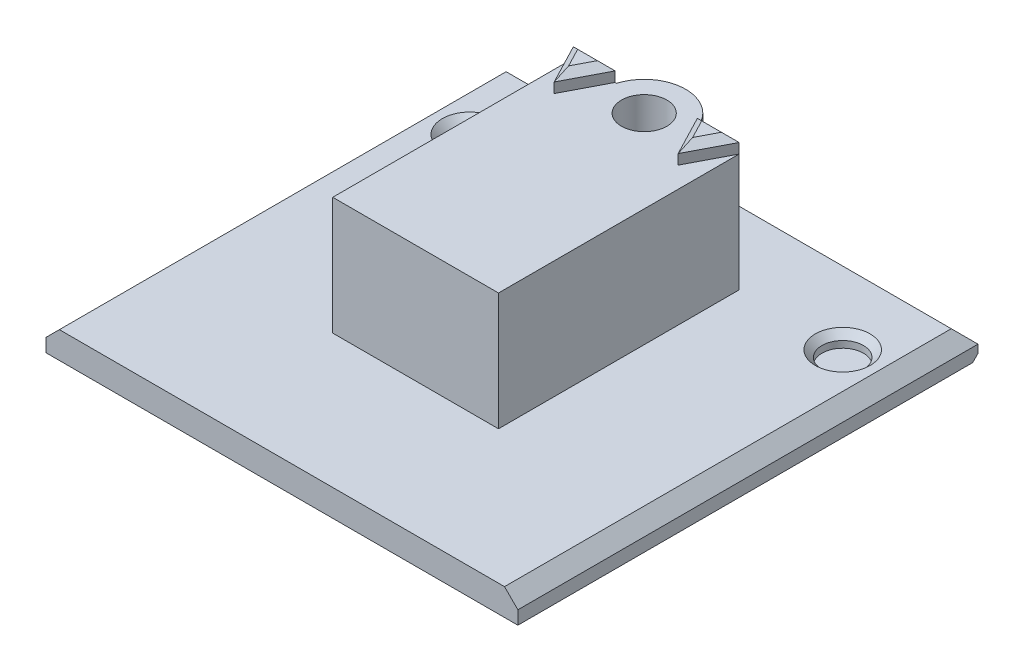
ISO-10303-21;
HEADER;
FILE_DESCRIPTION(('STEP AP214'),'2;1');
FILE_NAME('part.step','',(''),(''),'','','');
FILE_SCHEMA(('AUTOMOTIVE_DESIGN { 1 0 10303 214 1 1 1 1 }'));
ENDSEC;
DATA;
#1=APPLICATION_CONTEXT('core data for automotive mechanical design processes');
#2=APPLICATION_PROTOCOL_DEFINITION('international standard','automotive_design',2000,#1);
#3=PRODUCT_CONTEXT('',#1,'mechanical');
#4=PRODUCT('Part','Part','',(#3));
#5=PRODUCT_RELATED_PRODUCT_CATEGORY('part','',(#4));
#6=PRODUCT_DEFINITION_FORMATION('','',#4);
#7=PRODUCT_DEFINITION_CONTEXT('part definition',#1,'design');
#8=PRODUCT_DEFINITION('design','',#6,#7);
#9=PRODUCT_DEFINITION_SHAPE('','',#8);
#10=(LENGTH_UNIT() NAMED_UNIT(*) SI_UNIT(.MILLI.,.METRE.));
#11=(NAMED_UNIT(*) PLANE_ANGLE_UNIT() SI_UNIT($,.RADIAN.));
#12=(NAMED_UNIT(*) SI_UNIT($,.STERADIAN.) SOLID_ANGLE_UNIT());
#13=UNCERTAINTY_MEASURE_WITH_UNIT(LENGTH_MEASURE(1.E-05),#10,'distance_accuracy_value','');
#14=(GEOMETRIC_REPRESENTATION_CONTEXT(3) GLOBAL_UNCERTAINTY_ASSIGNED_CONTEXT((#13)) GLOBAL_UNIT_ASSIGNED_CONTEXT((#10,
#11,#12)) REPRESENTATION_CONTEXT('',''));
#15=CARTESIAN_POINT('',(0.,0.,0.));
#16=DIRECTION('',(0.,0.,1.));
#17=DIRECTION('',(1.,0.,0.));
#18=AXIS2_PLACEMENT_3D('',#15,#16,#17);
#19=CARTESIAN_POINT('',(17.65,0.,-27.1));
#20=DIRECTION('',(0.,1.,0.));
#21=DIRECTION('',(0.,0.,1.));
#22=AXIS2_PLACEMENT_3D('',#19,#20,#21);
#23=CYLINDRICAL_SURFACE('',#22,1.7);
#24=CARTESIAN_POINT('',(17.65,10.8,-27.1));
#25=DIRECTION('',(0.,1.,0.));
#26=DIRECTION('',(0.,0.,1.));
#27=AXIS2_PLACEMENT_3D('',#24,#25,#26);
#28=CIRCLE('',#27,1.7);
#29=CARTESIAN_POINT('',(17.65,10.8,-25.4));
#30=VERTEX_POINT('',#29);
#31=EDGE_CURVE('E217',#30,#30,#28,.T.);
#32=CARTESIAN_POINT('',(17.65,3.,-27.1));
#33=DIRECTION('',(0.,-1.,0.));
#34=DIRECTION('',(0.,0.,-1.));
#35=AXIS2_PLACEMENT_3D('',#32,#33,#34);
#36=CIRCLE('',#35,1.7);
#37=CARTESIAN_POINT('',(17.65,3.,-25.4));
#38=VERTEX_POINT('',#37);
#39=EDGE_CURVE('E317',#38,#38,#36,.F.);
#40=CARTESIAN_POINT('',(17.65,10.8,-25.4));
#41=CARTESIAN_POINT('',(17.65,10.71875,-25.4));
#42=CARTESIAN_POINT('',(17.65,10.6375,-25.4));
#43=CARTESIAN_POINT('',(17.65,10.475,-25.4));
#44=CARTESIAN_POINT('',(17.65,10.39375,-25.4));
#45=CARTESIAN_POINT('',(17.65,10.23125,-25.4));
#46=CARTESIAN_POINT('',(17.65,10.15,-25.4));
#47=CARTESIAN_POINT('',(17.65,9.9875,-25.4));
#48=CARTESIAN_POINT('',(17.65,9.90625,-25.4));
#49=CARTESIAN_POINT('',(17.65,9.74375,-25.4));
#50=CARTESIAN_POINT('',(17.65,9.6625,-25.4));
#51=CARTESIAN_POINT('',(17.65,9.5,-25.4));
#52=CARTESIAN_POINT('',(17.65,9.41875,-25.4));
#53=CARTESIAN_POINT('',(17.65,9.25625,-25.4));
#54=CARTESIAN_POINT('',(17.65,9.175,-25.4));
#55=CARTESIAN_POINT('',(17.65,9.0125,-25.4));
#56=CARTESIAN_POINT('',(17.65,8.93125,-25.4));
#57=CARTESIAN_POINT('',(17.65,8.76875,-25.4));
#58=CARTESIAN_POINT('',(17.65,8.6875,-25.4));
#59=CARTESIAN_POINT('',(17.65,8.525,-25.4));
#60=CARTESIAN_POINT('',(17.65,8.44375,-25.4));
#61=CARTESIAN_POINT('',(17.65,8.28125,-25.4));
#62=CARTESIAN_POINT('',(17.65,8.2,-25.4));
#63=CARTESIAN_POINT('',(17.65,8.0375,-25.4));
#64=CARTESIAN_POINT('',(17.65,7.95625,-25.4));
#65=CARTESIAN_POINT('',(17.65,7.79375,-25.4));
#66=CARTESIAN_POINT('',(17.65,7.7125,-25.4));
#67=CARTESIAN_POINT('',(17.65,7.55,-25.4));
#68=CARTESIAN_POINT('',(17.65,7.46875,-25.4));
#69=CARTESIAN_POINT('',(17.65,7.30625,-25.4));
#70=CARTESIAN_POINT('',(17.65,7.225,-25.4));
#71=CARTESIAN_POINT('',(17.65,7.0625,-25.4));
#72=CARTESIAN_POINT('',(17.65,6.98125,-25.4));
#73=CARTESIAN_POINT('',(17.65,6.81875,-25.4));
#74=CARTESIAN_POINT('',(17.65,6.7375,-25.4));
#75=CARTESIAN_POINT('',(17.65,6.575,-25.4));
#76=CARTESIAN_POINT('',(17.65,6.49375,-25.4));
#77=CARTESIAN_POINT('',(17.65,6.33125,-25.4));
#78=CARTESIAN_POINT('',(17.65,6.25,-25.4));
#79=CARTESIAN_POINT('',(17.65,6.0875,-25.4));
#80=CARTESIAN_POINT('',(17.65,6.00625,-25.4));
#81=CARTESIAN_POINT('',(17.65,5.84375,-25.4));
#82=CARTESIAN_POINT('',(17.65,5.7625,-25.4));
#83=CARTESIAN_POINT('',(17.65,5.6,-25.4));
#84=CARTESIAN_POINT('',(17.65,5.51875,-25.4));
#85=CARTESIAN_POINT('',(17.65,5.35625,-25.4));
#86=CARTESIAN_POINT('',(17.65,5.275,-25.4));
#87=CARTESIAN_POINT('',(17.65,5.1125,-25.4));
#88=CARTESIAN_POINT('',(17.65,5.03125,-25.4));
#89=CARTESIAN_POINT('',(17.65,4.86875,-25.4));
#90=CARTESIAN_POINT('',(17.65,4.7875,-25.4));
#91=CARTESIAN_POINT('',(17.65,4.625,-25.4));
#92=CARTESIAN_POINT('',(17.65,4.54375,-25.4));
#93=CARTESIAN_POINT('',(17.65,4.38125,-25.4));
#94=CARTESIAN_POINT('',(17.65,4.3,-25.4));
#95=CARTESIAN_POINT('',(17.65,4.1375,-25.4));
#96=CARTESIAN_POINT('',(17.65,4.05625,-25.4));
#97=CARTESIAN_POINT('',(17.65,3.89375,-25.4));
#98=CARTESIAN_POINT('',(17.65,3.8125,-25.4));
#99=CARTESIAN_POINT('',(17.65,3.65,-25.4));
#100=CARTESIAN_POINT('',(17.65,3.56875,-25.4));
#101=CARTESIAN_POINT('',(17.65,3.40625,-25.4));
#102=CARTESIAN_POINT('',(17.65,3.325,-25.4));
#103=CARTESIAN_POINT('',(17.65,3.1625,-25.4));
#104=CARTESIAN_POINT('',(17.65,3.08125,-25.4));
#105=CARTESIAN_POINT('',(17.65,3.,-25.4));
#106=B_SPLINE_CURVE_WITH_KNOTS('',3,(#40,#41,#42,#43,#44,#45,#46,#47,#48,#49,#50,#51,#52,#53,
#54,#55,#56,#57,#58,#59,#60,#61,#62,#63,#64,#65,#66,#67,#68,#69,#70,#71,#72,#73,#74,#75,#76,#77,
#78,#79,#80,#81,#82,#83,#84,#85,#86,#87,#88,#89,#90,#91,#92,#93,#94,#95,#96,#97,#98,#99,#100,
#101,#102,#103,#104,#105),.UNSPECIFIED.,.F.,.F.,(4,2,2,2,2,2,2,2,2,2,2,2,2,2,2,2,2,2,2,2,2,2,2,
2,2,2,2,2,2,2,2,2,4),(0.,0.243749999999999,0.4875,0.731249999999999,0.975,1.21875,1.4625,
1.70625,1.95,2.19375,2.4375,2.68125,2.925,3.16875,3.4125,3.65625,3.9,4.14375,4.3875,4.63125,
4.875,5.11875,5.3625,5.60625,5.85,6.09375,6.3375,6.58125,6.825,7.06875,7.3125,7.55625,7.8),.UNSPECIFIED.);
#107=EDGE_CURVE('BSEAM41',#30,#38,#106,.T.);
#108=ORIENTED_EDGE('',*,*,#31,.T.);
#109=ORIENTED_EDGE('',*,*,#39,.F.);
#110=ORIENTED_EDGE('',*,*,#107,.T.);
#111=ORIENTED_EDGE('',*,*,#107,.F.);
#112=EDGE_LOOP('',(#108,#110,#109,#111));
#113=FACE_BOUND('',#112,.T.);
#114=ADVANCED_FACE('F41',(#113),#23,.F.);
#115=CARTESIAN_POINT('',(0.,2.,0.));
#116=DIRECTION('',(0.,-1.,0.));
#117=DIRECTION('',(0.,0.,-1.));
#118=AXIS2_PLACEMENT_3D('',#115,#116,#117);
#119=PLANE('',#118);
#120=CARTESIAN_POINT('',(31.6,2.,-28.));
#121=DIRECTION('',(0.,-1.,0.));
#122=DIRECTION('',(0.,0.,-1.));
#123=AXIS2_PLACEMENT_3D('',#120,#121,#122);
#124=CIRCLE('',#123,2.05);
#125=CARTESIAN_POINT('',(31.6,2.,-30.05));
#126=VERTEX_POINT('',#125);
#127=EDGE_CURVE('E307',#126,#126,#124,.T.);
#128=ORIENTED_EDGE('',*,*,#127,.T.);
#129=EDGE_LOOP('',(#128));
#130=FACE_BOUND('',#129,.T.);
#131=CARTESIAN_POINT('',(3.69999999999999,2.,-28.));
#132=DIRECTION('',(0.,-1.,0.));
#133=DIRECTION('',(0.,0.,-1.));
#134=AXIS2_PLACEMENT_3D('',#131,#132,#133);
#135=CIRCLE('',#134,2.05);
#136=CARTESIAN_POINT('',(3.69999999999999,2.,-30.05));
#137=VERTEX_POINT('',#136);
#138=EDGE_CURVE('E306',#137,#137,#135,.T.);
#139=ORIENTED_EDGE('',*,*,#138,.T.);
#140=EDGE_LOOP('',(#139));
#141=FACE_BOUND('',#140,.T.);
#142=DIRECTION('',(1.,0.,0.));
#143=VECTOR('',#142,1.);
#144=CARTESIAN_POINT('',(0.,2.,0.));
#145=LINE('',#144,#143);
#146=CARTESIAN_POINT('',(1.,2.,0.));
#147=VERTEX_POINT('',#146);
#148=CARTESIAN_POINT('',(34.3,2.,0.));
#149=VERTEX_POINT('',#148);
#150=EDGE_CURVE('E281',#147,#149,#145,.T.);
#151=ORIENTED_EDGE('',*,*,#150,.T.);
#152=DIRECTION('',(0.,0.,-1.));
#153=VECTOR('',#152,1.);
#154=CARTESIAN_POINT('',(34.3,2.,0.));
#155=LINE('',#154,#153);
#156=CARTESIAN_POINT('',(34.3,2.,-33.42));
#157=VERTEX_POINT('',#156);
#158=EDGE_CURVE('E362',#149,#157,#155,.T.);
#159=ORIENTED_EDGE('',*,*,#158,.T.);
#160=DIRECTION('',(-1.,0.,0.));
#161=VECTOR('',#160,1.);
#162=CARTESIAN_POINT('',(0.,2.,-33.42));
#163=LINE('',#162,#161);
#164=CARTESIAN_POINT('',(1.,2.,-33.42));
#165=VERTEX_POINT('',#164);
#166=EDGE_CURVE('E361',#157,#165,#163,.T.);
#167=ORIENTED_EDGE('',*,*,#166,.T.);
#168=DIRECTION('',(0.,0.,1.));
#169=VECTOR('',#168,1.);
#170=CARTESIAN_POINT('',(1.,2.,0.));
#171=LINE('',#170,#169);
#172=EDGE_CURVE('E344',#165,#147,#171,.T.);
#173=ORIENTED_EDGE('',*,*,#172,.T.);
#174=EDGE_LOOP('',(#151,#159,#167,#173));
#175=FACE_BOUND('',#174,.T.);
#176=DIRECTION('',(0.,0.,-1.));
#177=VECTOR('',#176,1.);
#178=CARTESIAN_POINT('',(23.85,2.,-28.));
#179=LINE('',#178,#177);
#180=CARTESIAN_POINT('',(23.85,2.,-10.));
#181=VERTEX_POINT('',#180);
#182=CARTESIAN_POINT('',(23.85,2.,-28.));
#183=VERTEX_POINT('',#182);
#184=EDGE_CURVE('E231',#181,#183,#179,.T.);
#185=ORIENTED_EDGE('',*,*,#184,.F.);
#186=DIRECTION('',(1.,0.,0.));
#187=VECTOR('',#186,1.);
#188=CARTESIAN_POINT('',(11.45,2.,-10.));
#189=LINE('',#188,#187);
#190=CARTESIAN_POINT('',(11.45,2.,-10.));
#191=VERTEX_POINT('',#190);
#192=EDGE_CURVE('E238',#191,#181,#189,.T.);
#193=ORIENTED_EDGE('',*,*,#192,.F.);
#194=DIRECTION('',(0.,0.,1.));
#195=VECTOR('',#194,1.);
#196=CARTESIAN_POINT('',(11.45,2.,-28.));
#197=LINE('',#196,#195);
#198=CARTESIAN_POINT('',(11.45,2.,-28.));
#199=VERTEX_POINT('',#198);
#200=EDGE_CURVE('E262',#199,#191,#197,.T.);
#201=ORIENTED_EDGE('',*,*,#200,.F.);
#202=DIRECTION('',(-1.,0.,0.));
#203=VECTOR('',#202,1.);
#204=CARTESIAN_POINT('',(11.45,2.,-28.));
#205=LINE('',#204,#203);
#206=CARTESIAN_POINT('',(14.6835206051617,2.,-28.));
#207=VERTEX_POINT('',#206);
#208=EDGE_CURVE('E256',#207,#199,#205,.T.);
#209=ORIENTED_EDGE('',*,*,#208,.F.);
#210=CARTESIAN_POINT('',(17.65,2.,-27.1));
#211=DIRECTION('',(0.,1.,0.));
#212=DIRECTION('',(0.,0.,1.));
#213=AXIS2_PLACEMENT_3D('',#210,#211,#212);
#214=CIRCLE('',#213,3.1);
#215=CARTESIAN_POINT('',(20.6164793948383,2.,-28.));
#216=VERTEX_POINT('',#215);
#217=EDGE_CURVE('E253',#216,#207,#214,.T.);
#218=ORIENTED_EDGE('',*,*,#217,.F.);
#219=DIRECTION('',(-1.,0.,0.));
#220=VECTOR('',#219,1.);
#221=CARTESIAN_POINT('',(20.6164793948383,2.,-28.));
#222=LINE('',#221,#220);
#223=EDGE_CURVE('E255',#183,#216,#222,.T.);
#224=ORIENTED_EDGE('',*,*,#223,.F.);
#225=EDGE_LOOP('',(#185,#193,#201,#209,#218,#224));
#226=FACE_BOUND('',#225,.T.);
#227=ADVANCED_FACE('F420',(#130,#141,#175,#226),#119,.F.);
#228=CARTESIAN_POINT('',(0.,2.,0.));
#229=DIRECTION('',(1.,0.,0.));
#230=DIRECTION('',(0.,0.,-1.));
#231=AXIS2_PLACEMENT_3D('',#228,#229,#230);
#232=PLANE('',#231);
#233=DIRECTION('',(0.,-1.,0.));
#234=VECTOR('',#233,1.);
#235=CARTESIAN_POINT('',(0.,2.,-34.42));
#236=LINE('',#235,#234);
#237=CARTESIAN_POINT('',(0.,0.999999999999992,-34.42));
#238=VERTEX_POINT('',#237);
#239=CARTESIAN_POINT('',(0.,0.399999999999998,-34.42));
#240=VERTEX_POINT('',#239);
#241=EDGE_CURVE('E290',#238,#240,#236,.T.);
#242=ORIENTED_EDGE('',*,*,#241,.T.);
#243=DIRECTION('',(0.,-0.707106781186548,0.707106781186548));
#244=VECTOR('',#243,1.);
#245=CARTESIAN_POINT('',(0.,0.399999999999998,-34.42));
#246=LINE('',#245,#244);
#247=CARTESIAN_POINT('',(0.,0.,-34.02));
#248=VERTEX_POINT('',#247);
#249=EDGE_CURVE('E62',#240,#248,#246,.T.);
#250=ORIENTED_EDGE('',*,*,#249,.T.);
#251=DIRECTION('',(0.,0.,1.));
#252=VECTOR('',#251,1.);
#253=CARTESIAN_POINT('',(0.,0.,0.));
#254=LINE('',#253,#252);
#255=CARTESIAN_POINT('',(0.,0.,0.));
#256=VERTEX_POINT('',#255);
#257=EDGE_CURVE('E284',#248,#256,#254,.T.);
#258=ORIENTED_EDGE('',*,*,#257,.T.);
#259=DIRECTION('',(0.,-1.,0.));
#260=VECTOR('',#259,1.);
#261=CARTESIAN_POINT('',(0.,2.,0.));
#262=LINE('',#261,#260);
#263=CARTESIAN_POINT('',(0.,0.999999999999992,0.));
#264=VERTEX_POINT('',#263);
#265=EDGE_CURVE('E297',#264,#256,#262,.T.);
#266=ORIENTED_EDGE('',*,*,#265,.F.);
#267=DIRECTION('',(0.,0.,-1.));
#268=VECTOR('',#267,1.);
#269=CARTESIAN_POINT('',(0.,0.999999999999992,0.));
#270=LINE('',#269,#268);
#271=EDGE_CURVE('E376',#264,#238,#270,.T.);
#272=ORIENTED_EDGE('',*,*,#271,.T.);
#273=EDGE_LOOP('',(#242,#250,#258,#266,#272));
#274=FACE_BOUND('',#273,.T.);
#275=ADVANCED_FACE('F394',(#274),#232,.F.);
#276=CARTESIAN_POINT('',(0.,2.,0.));
#277=DIRECTION('',(0.,0.,-1.));
#278=DIRECTION('',(-1.,0.,0.));
#279=AXIS2_PLACEMENT_3D('',#276,#277,#278);
#280=PLANE('',#279);
#281=DIRECTION('',(0.,-1.,0.));
#282=VECTOR('',#281,1.);
#283=CARTESIAN_POINT('',(35.3,2.,0.));
#284=LINE('',#283,#282);
#285=CARTESIAN_POINT('',(35.3,0.999999999999992,0.));
#286=VERTEX_POINT('',#285);
#287=CARTESIAN_POINT('',(35.3,0.,0.));
#288=VERTEX_POINT('',#287);
#289=EDGE_CURVE('E296',#286,#288,#284,.T.);
#290=ORIENTED_EDGE('',*,*,#289,.F.);
#291=DIRECTION('',(0.707106781186545,-0.70710678118655,0.));
#292=VECTOR('',#291,1.);
#293=CARTESIAN_POINT('',(34.3,2.,0.));
#294=LINE('',#293,#292);
#295=EDGE_CURVE('E375',#286,#149,#294,.F.);
#296=ORIENTED_EDGE('',*,*,#295,.T.);
#297=ORIENTED_EDGE('',*,*,#150,.F.);
#298=DIRECTION('',(0.707106781186545,0.70710678118655,0.));
#299=VECTOR('',#298,1.);
#300=CARTESIAN_POINT('',(1.,2.,0.));
#301=LINE('',#300,#299);
#302=EDGE_CURVE('E369',#147,#264,#301,.F.);
#303=ORIENTED_EDGE('',*,*,#302,.T.);
#304=ORIENTED_EDGE('',*,*,#265,.T.);
#305=DIRECTION('',(1.,0.,0.));
#306=VECTOR('',#305,1.);
#307=CARTESIAN_POINT('',(0.,0.,0.));
#308=LINE('',#307,#306);
#309=EDGE_CURVE('E289',#256,#288,#308,.T.);
#310=ORIENTED_EDGE('',*,*,#309,.T.);
#311=EDGE_LOOP('',(#290,#296,#297,#303,#304,#310));
#312=FACE_BOUND('',#311,.T.);
#313=ADVANCED_FACE('F413',(#312),#280,.F.);
#314=CARTESIAN_POINT('',(35.3,2.,0.));
#315=DIRECTION('',(-1.,0.,0.));
#316=DIRECTION('',(0.,0.,1.));
#317=AXIS2_PLACEMENT_3D('',#314,#315,#316);
#318=PLANE('',#317);
#319=DIRECTION('',(0.,0.,-1.));
#320=VECTOR('',#319,1.);
#321=CARTESIAN_POINT('',(35.3,0.,0.));
#322=LINE('',#321,#320);
#323=CARTESIAN_POINT('',(35.3,0.,-34.02));
#324=VERTEX_POINT('',#323);
#325=EDGE_CURVE('E286',#288,#324,#322,.T.);
#326=ORIENTED_EDGE('',*,*,#325,.T.);
#327=DIRECTION('',(0.,0.707106781186548,-0.707106781186548));
#328=VECTOR('',#327,1.);
#329=CARTESIAN_POINT('',(35.3,0.399999999999998,-34.42));
#330=LINE('',#329,#328);
#331=CARTESIAN_POINT('',(35.3,0.399999999999998,-34.42));
#332=VERTEX_POINT('',#331);
#333=EDGE_CURVE('E11',#324,#332,#330,.T.);
#334=ORIENTED_EDGE('',*,*,#333,.T.);
#335=DIRECTION('',(0.,-1.,0.));
#336=VECTOR('',#335,1.);
#337=CARTESIAN_POINT('',(35.3,2.,-34.42));
#338=LINE('',#337,#336);
#339=CARTESIAN_POINT('',(35.3,0.999999999999992,-34.42));
#340=VERTEX_POINT('',#339);
#341=EDGE_CURVE('E294',#340,#332,#338,.T.);
#342=ORIENTED_EDGE('',*,*,#341,.F.);
#343=DIRECTION('',(0.,0.,1.));
#344=VECTOR('',#343,1.);
#345=CARTESIAN_POINT('',(35.3,0.999999999999992,0.));
#346=LINE('',#345,#344);
#347=EDGE_CURVE('E368',#340,#286,#346,.T.);
#348=ORIENTED_EDGE('',*,*,#347,.T.);
#349=ORIENTED_EDGE('',*,*,#289,.T.);
#350=EDGE_LOOP('',(#326,#334,#342,#348,#349));
#351=FACE_BOUND('',#350,.T.);
#352=ADVANCED_FACE('F410',(#351),#318,.F.);
#353=CARTESIAN_POINT('',(0.,2.,-34.42));
#354=DIRECTION('',(0.,0.,1.));
#355=DIRECTION('',(1.,0.,0.));
#356=AXIS2_PLACEMENT_3D('',#353,#354,#355);
#357=PLANE('',#356);
#358=ORIENTED_EDGE('',*,*,#341,.T.);
#359=DIRECTION('',(-1.,0.,0.));
#360=VECTOR('',#359,1.);
#361=CARTESIAN_POINT('',(0.,0.399999999999998,-34.42));
#362=LINE('',#361,#360);
#363=EDGE_CURVE('E377',#332,#240,#362,.T.);
#364=ORIENTED_EDGE('',*,*,#363,.T.);
#365=ORIENTED_EDGE('',*,*,#241,.F.);
#366=DIRECTION('',(1.,0.,0.));
#367=VECTOR('',#366,1.);
#368=CARTESIAN_POINT('',(0.,0.999999999999992,-34.42));
#369=LINE('',#368,#367);
#370=EDGE_CURVE('E372',#238,#340,#369,.T.);
#371=ORIENTED_EDGE('',*,*,#370,.T.);
#372=EDGE_LOOP('',(#358,#364,#365,#371));
#373=FACE_BOUND('',#372,.T.);
#374=ADVANCED_FACE('F386',(#373),#357,.F.);
#375=CARTESIAN_POINT('',(0.,0.,0.));
#376=DIRECTION('',(0.,-1.,0.));
#377=DIRECTION('',(0.,0.,-1.));
#378=AXIS2_PLACEMENT_3D('',#375,#376,#377);
#379=PLANE('',#378);
#380=CARTESIAN_POINT('',(17.65,0.,-27.1));
#381=DIRECTION('',(0.,-1.,0.));
#382=DIRECTION('',(0.,0.,-1.));
#383=AXIS2_PLACEMENT_3D('',#380,#381,#382);
#384=CIRCLE('',#383,2.85);
#385=CARTESIAN_POINT('',(17.65,0.,-29.95));
#386=VERTEX_POINT('',#385);
#387=EDGE_CURVE('E352',#386,#386,#384,.T.);
#388=ORIENTED_EDGE('',*,*,#387,.F.);
#389=EDGE_LOOP('',(#388));
#390=FACE_BOUND('',#389,.T.);
#391=ORIENTED_EDGE('',*,*,#257,.F.);
#392=DIRECTION('',(1.,0.,0.));
#393=VECTOR('',#392,1.);
#394=CARTESIAN_POINT('',(35.3,0.,-34.02));
#395=LINE('',#394,#393);
#396=EDGE_CURVE('E49',#248,#324,#395,.T.);
#397=ORIENTED_EDGE('',*,*,#396,.T.);
#398=ORIENTED_EDGE('',*,*,#325,.F.);
#399=ORIENTED_EDGE('',*,*,#309,.F.);
#400=EDGE_LOOP('',(#391,#397,#398,#399));
#401=FACE_BOUND('',#400,.T.);
#402=ADVANCED_FACE('F747',(#390,#401),#379,.T.);
#403=CARTESIAN_POINT('',(23.85,10.8,-28.));
#404=DIRECTION('',(-1.,0.,0.));
#405=DIRECTION('',(0.,0.,1.));
#406=AXIS2_PLACEMENT_3D('',#403,#404,#405);
#407=PLANE('',#406);
#408=ORIENTED_EDGE('',*,*,#184,.T.);
#409=DIRECTION('',(0.,-1.,0.));
#410=VECTOR('',#409,1.);
#411=CARTESIAN_POINT('',(23.85,10.8,-28.));
#412=LINE('',#411,#410);
#413=CARTESIAN_POINT('',(23.85,10.8,-28.));
#414=VERTEX_POINT('',#413);
#415=EDGE_CURVE('E279',#414,#183,#412,.T.);
#416=ORIENTED_EDGE('',*,*,#415,.F.);
#417=DIRECTION('',(0.,0.,-1.));
#418=VECTOR('',#417,1.);
#419=CARTESIAN_POINT('',(23.85,10.8,-28.));
#420=LINE('',#419,#418);
#421=CARTESIAN_POINT('',(23.85,10.8,-10.));
#422=VERTEX_POINT('',#421);
#423=EDGE_CURVE('E204',#422,#414,#420,.T.);
#424=ORIENTED_EDGE('',*,*,#423,.F.);
#425=DIRECTION('',(0.,-1.,0.));
#426=VECTOR('',#425,1.);
#427=CARTESIAN_POINT('',(23.85,10.8,-10.));
#428=LINE('',#427,#426);
#429=EDGE_CURVE('E248',#422,#181,#428,.T.);
#430=ORIENTED_EDGE('',*,*,#429,.T.);
#431=EDGE_LOOP('',(#408,#416,#424,#430));
#432=FACE_BOUND('',#431,.T.);
#433=ADVANCED_FACE('F426',(#432),#407,.F.);
#434=CARTESIAN_POINT('',(20.6164793948383,10.8,-28.));
#435=DIRECTION('',(0.,0.,1.));
#436=DIRECTION('',(1.,0.,0.));
#437=AXIS2_PLACEMENT_3D('',#434,#435,#436);
#438=PLANE('',#437);
#439=DIRECTION('',(0.,-1.,0.));
#440=VECTOR('',#439,1.);
#441=CARTESIAN_POINT('',(20.7265976966895,12.05,-28.));
#442=LINE('',#441,#440);
#443=CARTESIAN_POINT('',(20.7265976966895,11.55,-28.));
#444=VERTEX_POINT('',#443);
#445=CARTESIAN_POINT('',(20.7265976966895,10.8,-28.));
#446=VERTEX_POINT('',#445);
#447=EDGE_CURVE('E194',#444,#446,#442,.T.);
#448=ORIENTED_EDGE('',*,*,#447,.F.);
#449=DIRECTION('',(1.,0.,0.));
#450=VECTOR('',#449,1.);
#451=CARTESIAN_POINT('',(20.6164793948383,11.55,-28.));
#452=LINE('',#451,#450);
#453=CARTESIAN_POINT('',(23.85,11.55,-28.));
#454=VERTEX_POINT('',#453);
#455=EDGE_CURVE('E345',#444,#454,#452,.T.);
#456=ORIENTED_EDGE('',*,*,#455,.T.);
#457=DIRECTION('',(0.,-1.,0.));
#458=VECTOR('',#457,1.);
#459=CARTESIAN_POINT('',(23.85,12.05,-28.));
#460=LINE('',#459,#458);
#461=EDGE_CURVE('E197',#454,#414,#460,.T.);
#462=ORIENTED_EDGE('',*,*,#461,.T.);
#463=ORIENTED_EDGE('',*,*,#415,.T.);
#464=ORIENTED_EDGE('',*,*,#223,.T.);
#465=DIRECTION('',(0.,-1.,0.));
#466=VECTOR('',#465,1.);
#467=CARTESIAN_POINT('',(20.6164793948383,10.8,-28.));
#468=LINE('',#467,#466);
#469=CARTESIAN_POINT('',(20.6164793948383,10.8,-28.));
#470=VERTEX_POINT('',#469);
#471=EDGE_CURVE('E280',#470,#216,#468,.T.);
#472=ORIENTED_EDGE('',*,*,#471,.F.);
#473=DIRECTION('',(-1.,0.,0.));
#474=VECTOR('',#473,1.);
#475=CARTESIAN_POINT('',(20.6164793948383,10.8,-28.));
#476=LINE('',#475,#474);
#477=EDGE_CURVE('E240',#446,#470,#476,.T.);
#478=ORIENTED_EDGE('',*,*,#477,.F.);
#479=EDGE_LOOP('',(#448,#456,#462,#463,#464,#472,#478));
#480=FACE_BOUND('',#479,.T.);
#481=ADVANCED_FACE('F427',(#480),#438,.F.);
#482=CARTESIAN_POINT('',(17.65,10.8,-27.1));
#483=DIRECTION('',(0.,-1.,0.));
#484=DIRECTION('',(0.,0.,-1.));
#485=AXIS2_PLACEMENT_3D('',#482,#483,#484);
#486=CYLINDRICAL_SURFACE('',#485,3.1);
#487=ORIENTED_EDGE('',*,*,#217,.T.);
#488=DIRECTION('',(0.,-1.,0.));
#489=VECTOR('',#488,1.);
#490=CARTESIAN_POINT('',(14.6835206051617,10.8,-28.));
#491=LINE('',#490,#489);
#492=CARTESIAN_POINT('',(14.6835206051617,10.8,-28.));
#493=VERTEX_POINT('',#492);
#494=EDGE_CURVE('E274',#493,#207,#491,.T.);
#495=ORIENTED_EDGE('',*,*,#494,.F.);
#496=CARTESIAN_POINT('',(17.65,10.8,-27.1));
#497=DIRECTION('',(0.,1.,0.));
#498=DIRECTION('',(0.,0.,1.));
#499=AXIS2_PLACEMENT_3D('',#496,#497,#498);
#500=CIRCLE('',#499,3.1);
#501=EDGE_CURVE('E239',#470,#493,#500,.T.);
#502=ORIENTED_EDGE('',*,*,#501,.F.);
#503=ORIENTED_EDGE('',*,*,#471,.T.);
#504=EDGE_LOOP('',(#487,#495,#502,#503));
#505=FACE_BOUND('',#504,.T.);
#506=ADVANCED_FACE('F448',(#505),#486,.T.);
#507=CARTESIAN_POINT('',(11.45,10.8,-28.));
#508=DIRECTION('',(0.,0.,1.));
#509=DIRECTION('',(1.,0.,0.));
#510=AXIS2_PLACEMENT_3D('',#507,#508,#509);
#511=PLANE('',#510);
#512=DIRECTION('',(0.,-1.,0.));
#513=VECTOR('',#512,1.);
#514=CARTESIAN_POINT('',(11.45,12.05,-28.));
#515=LINE('',#514,#513);
#516=CARTESIAN_POINT('',(11.45,11.55,-28.));
#517=VERTEX_POINT('',#516);
#518=CARTESIAN_POINT('',(11.45,10.8,-28.));
#519=VERTEX_POINT('',#518);
#520=EDGE_CURVE('E225',#517,#519,#515,.T.);
#521=ORIENTED_EDGE('',*,*,#520,.F.);
#522=DIRECTION('',(1.,0.,0.));
#523=VECTOR('',#522,1.);
#524=CARTESIAN_POINT('',(14.5734023033105,11.55,-28.));
#525=LINE('',#524,#523);
#526=CARTESIAN_POINT('',(14.5734023033105,11.55,-28.));
#527=VERTEX_POINT('',#526);
#528=EDGE_CURVE('E326',#517,#527,#525,.T.);
#529=ORIENTED_EDGE('',*,*,#528,.T.);
#530=DIRECTION('',(0.,-1.,0.));
#531=VECTOR('',#530,1.);
#532=CARTESIAN_POINT('',(14.5734023033105,12.05,-28.));
#533=LINE('',#532,#531);
#534=CARTESIAN_POINT('',(14.5734023033105,10.8,-28.));
#535=VERTEX_POINT('',#534);
#536=EDGE_CURVE('E228',#527,#535,#533,.T.);
#537=ORIENTED_EDGE('',*,*,#536,.T.);
#538=DIRECTION('',(-1.,0.,0.));
#539=VECTOR('',#538,1.);
#540=CARTESIAN_POINT('',(11.45,10.8,-28.));
#541=LINE('',#540,#539);
#542=EDGE_CURVE('E245',#493,#535,#541,.T.);
#543=ORIENTED_EDGE('',*,*,#542,.F.);
#544=ORIENTED_EDGE('',*,*,#494,.T.);
#545=ORIENTED_EDGE('',*,*,#208,.T.);
#546=DIRECTION('',(0.,-1.,0.));
#547=VECTOR('',#546,1.);
#548=CARTESIAN_POINT('',(11.45,10.8,-28.));
#549=LINE('',#548,#547);
#550=EDGE_CURVE('E272',#519,#199,#549,.T.);
#551=ORIENTED_EDGE('',*,*,#550,.F.);
#552=EDGE_LOOP('',(#521,#529,#537,#543,#544,#545,#551));
#553=FACE_BOUND('',#552,.T.);
#554=ADVANCED_FACE('F451',(#553),#511,.F.);
#555=CARTESIAN_POINT('',(11.45,10.8,-28.));
#556=DIRECTION('',(1.,0.,0.));
#557=DIRECTION('',(0.,0.,-1.));
#558=AXIS2_PLACEMENT_3D('',#555,#556,#557);
#559=PLANE('',#558);
#560=ORIENTED_EDGE('',*,*,#200,.T.);
#561=DIRECTION('',(0.,-1.,0.));
#562=VECTOR('',#561,1.);
#563=CARTESIAN_POINT('',(11.45,10.8,-10.));
#564=LINE('',#563,#562);
#565=CARTESIAN_POINT('',(11.45,10.8,-10.));
#566=VERTEX_POINT('',#565);
#567=EDGE_CURVE('E266',#566,#191,#564,.T.);
#568=ORIENTED_EDGE('',*,*,#567,.F.);
#569=DIRECTION('',(0.,0.,1.));
#570=VECTOR('',#569,1.);
#571=CARTESIAN_POINT('',(11.45,10.8,-28.));
#572=LINE('',#571,#570);
#573=EDGE_CURVE('E244',#519,#566,#572,.T.);
#574=ORIENTED_EDGE('',*,*,#573,.F.);
#575=ORIENTED_EDGE('',*,*,#550,.T.);
#576=EDGE_LOOP('',(#560,#568,#574,#575));
#577=FACE_BOUND('',#576,.T.);
#578=ADVANCED_FACE('F476',(#577),#559,.F.);
#579=CARTESIAN_POINT('',(11.45,10.8,-10.));
#580=DIRECTION('',(0.,0.,-1.));
#581=DIRECTION('',(-1.,0.,0.));
#582=AXIS2_PLACEMENT_3D('',#579,#580,#581);
#583=PLANE('',#582);
#584=ORIENTED_EDGE('',*,*,#192,.T.);
#585=ORIENTED_EDGE('',*,*,#429,.F.);
#586=DIRECTION('',(1.,0.,0.));
#587=VECTOR('',#586,1.);
#588=CARTESIAN_POINT('',(11.45,10.8,-10.));
#589=LINE('',#588,#587);
#590=EDGE_CURVE('E250',#566,#422,#589,.T.);
#591=ORIENTED_EDGE('',*,*,#590,.F.);
#592=ORIENTED_EDGE('',*,*,#567,.T.);
#593=EDGE_LOOP('',(#584,#585,#591,#592));
#594=FACE_BOUND('',#593,.T.);
#595=ADVANCED_FACE('F424',(#594),#583,.F.);
#596=CARTESIAN_POINT('',(17.65,10.8,-27.1));
#597=DIRECTION('',(0.,1.,0.));
#598=DIRECTION('',(0.,0.,1.));
#599=AXIS2_PLACEMENT_3D('',#596,#597,#598);
#600=PLANE('',#599);
#601=ORIENTED_EDGE('',*,*,#31,.F.);
#602=EDGE_LOOP('',(#601));
#603=FACE_BOUND('',#602,.T.);
#604=DIRECTION('',(0.461748613235039,0.,-0.887010833178219));
#605=VECTOR('',#604,1.);
#606=CARTESIAN_POINT('',(23.85,10.8,-28.));
#607=LINE('',#606,#605);
#608=CARTESIAN_POINT('',(22.2882988483447,10.8,-25.));
#609=VERTEX_POINT('',#608);
#610=EDGE_CURVE('E189',#609,#414,#607,.T.);
#611=ORIENTED_EDGE('',*,*,#610,.F.);
#612=DIRECTION('',(0.461748613235039,0.,0.887010833178219));
#613=VECTOR('',#612,1.);
#614=CARTESIAN_POINT('',(20.7265976966895,10.8,-28.));
#615=LINE('',#614,#613);
#616=EDGE_CURVE('E205',#446,#609,#615,.T.);
#617=ORIENTED_EDGE('',*,*,#616,.F.);
#618=ORIENTED_EDGE('',*,*,#477,.T.);
#619=ORIENTED_EDGE('',*,*,#501,.T.);
#620=ORIENTED_EDGE('',*,*,#542,.T.);
#621=DIRECTION('',(0.461748613235039,0.,-0.887010833178219));
#622=VECTOR('',#621,1.);
#623=CARTESIAN_POINT('',(14.5734023033105,10.8,-28.));
#624=LINE('',#623,#622);
#625=CARTESIAN_POINT('',(13.0117011516553,10.8,-25.));
#626=VERTEX_POINT('',#625);
#627=EDGE_CURVE('E211',#626,#535,#624,.T.);
#628=ORIENTED_EDGE('',*,*,#627,.F.);
#629=DIRECTION('',(0.461748613235039,0.,0.887010833178219));
#630=VECTOR('',#629,1.);
#631=CARTESIAN_POINT('',(11.45,10.8,-28.));
#632=LINE('',#631,#630);
#633=EDGE_CURVE('E208',#519,#626,#632,.T.);
#634=ORIENTED_EDGE('',*,*,#633,.F.);
#635=ORIENTED_EDGE('',*,*,#573,.T.);
#636=ORIENTED_EDGE('',*,*,#590,.T.);
#637=ORIENTED_EDGE('',*,*,#423,.T.);
#638=EDGE_LOOP('',(#611,#617,#618,#619,#620,#628,#634,#635,#636,#637));
#639=FACE_BOUND('',#638,.T.);
#640=ADVANCED_FACE('F203',(#603,#639),#600,.T.);
#641=CARTESIAN_POINT('',(31.6,1.,-28.));
#642=DIRECTION('',(0.,1.,0.));
#643=DIRECTION('',(0.,0.,1.));
#644=AXIS2_PLACEMENT_3D('',#641,#642,#643);
#645=CYLINDRICAL_SURFACE('',#644,1.55);
#646=CARTESIAN_POINT('',(31.6,1.5,-28.));
#647=DIRECTION('',(0.,-1.,0.));
#648=DIRECTION('',(0.,0.,-1.));
#649=AXIS2_PLACEMENT_3D('',#646,#647,#648);
#650=CIRCLE('',#649,1.55);
#651=CARTESIAN_POINT('',(31.6,1.5,-29.55));
#652=VERTEX_POINT('',#651);
#653=EDGE_CURVE('E303',#652,#652,#650,.F.);
#654=ORIENTED_EDGE('',*,*,#653,.T.);
#655=EDGE_LOOP('',(#654));
#656=FACE_BOUND('',#655,.T.);
#657=CARTESIAN_POINT('',(31.6,1.,-28.));
#658=DIRECTION('',(0.,1.,0.));
#659=DIRECTION('',(0.,0.,-1.));
#660=AXIS2_PLACEMENT_3D('',#657,#658,#659);
#661=CIRCLE('',#660,1.55);
#662=CARTESIAN_POINT('',(31.6,1.,-29.55));
#663=VERTEX_POINT('',#662);
#664=EDGE_CURVE('E223',#663,#663,#661,.T.);
#665=ORIENTED_EDGE('',*,*,#664,.F.);
#666=EDGE_LOOP('',(#665));
#667=FACE_BOUND('',#666,.T.);
#668=ADVANCED_FACE('F529',(#656,#667),#645,.F.);
#669=CARTESIAN_POINT('',(31.6,1.,-28.));
#670=DIRECTION('',(0.,-1.,0.));
#671=DIRECTION('',(0.,0.,-1.));
#672=AXIS2_PLACEMENT_3D('',#669,#670,#671);
#673=PLANE('',#672);
#674=ORIENTED_EDGE('',*,*,#664,.T.);
#675=EDGE_LOOP('',(#674));
#676=FACE_BOUND('',#675,.T.);
#677=ADVANCED_FACE('F526',(#676),#673,.F.);
#678=CARTESIAN_POINT('',(3.69999999999999,1.,-28.));
#679=DIRECTION('',(0.,1.,0.));
#680=DIRECTION('',(0.,0.,1.));
#681=AXIS2_PLACEMENT_3D('',#678,#679,#680);
#682=CYLINDRICAL_SURFACE('',#681,1.55);
#683=CARTESIAN_POINT('',(3.69999999999999,1.5,-28.));
#684=DIRECTION('',(0.,-1.,0.));
#685=DIRECTION('',(0.,0.,-1.));
#686=AXIS2_PLACEMENT_3D('',#683,#684,#685);
#687=CIRCLE('',#686,1.55);
#688=CARTESIAN_POINT('',(3.69999999999999,1.5,-29.55));
#689=VERTEX_POINT('',#688);
#690=EDGE_CURVE('E315',#689,#689,#687,.F.);
#691=ORIENTED_EDGE('',*,*,#690,.T.);
#692=EDGE_LOOP('',(#691));
#693=FACE_BOUND('',#692,.T.);
#694=CARTESIAN_POINT('',(3.69999999999999,1.,-28.));
#695=DIRECTION('',(0.,1.,0.));
#696=DIRECTION('',(0.,0.,1.));
#697=AXIS2_PLACEMENT_3D('',#694,#695,#696);
#698=CIRCLE('',#697,1.55);
#699=CARTESIAN_POINT('',(3.69999999999999,1.,-26.45));
#700=VERTEX_POINT('',#699);
#701=EDGE_CURVE('E229',#700,#700,#698,.T.);
#702=ORIENTED_EDGE('',*,*,#701,.F.);
#703=EDGE_LOOP('',(#702));
#704=FACE_BOUND('',#703,.T.);
#705=ADVANCED_FACE('F521',(#693,#704),#682,.F.);
#706=CARTESIAN_POINT('',(3.69999999999999,1.,-28.));
#707=DIRECTION('',(0.,1.,0.));
#708=DIRECTION('',(0.,0.,1.));
#709=AXIS2_PLACEMENT_3D('',#706,#707,#708);
#710=PLANE('',#709);
#711=ORIENTED_EDGE('',*,*,#701,.T.);
#712=EDGE_LOOP('',(#711));
#713=FACE_BOUND('',#712,.T.);
#714=ADVANCED_FACE('F519',(#713),#710,.T.);
#715=CARTESIAN_POINT('',(31.6,1.5,-28.));
#716=DIRECTION('',(0.,1.,0.));
#717=DIRECTION('',(0.,0.,1.));
#718=AXIS2_PLACEMENT_3D('',#715,#716,#717);
#719=CONICAL_SURFACE('',#718,1.55,0.78539816339745);
#720=ORIENTED_EDGE('',*,*,#127,.F.);
#721=EDGE_LOOP('',(#720));
#722=FACE_BOUND('',#721,.T.);
#723=ORIENTED_EDGE('',*,*,#653,.F.);
#724=EDGE_LOOP('',(#723));
#725=FACE_BOUND('',#724,.T.);
#726=ADVANCED_FACE('F524',(#722,#725),#719,.F.);
#727=CARTESIAN_POINT('',(3.69999999999999,1.5,-28.));
#728=DIRECTION('',(0.,1.,0.));
#729=DIRECTION('',(0.,0.,1.));
#730=AXIS2_PLACEMENT_3D('',#727,#728,#729);
#731=CONICAL_SURFACE('',#730,1.55,0.78539816339745);
#732=ORIENTED_EDGE('',*,*,#138,.F.);
#733=EDGE_LOOP('',(#732));
#734=FACE_BOUND('',#733,.T.);
#735=ORIENTED_EDGE('',*,*,#690,.F.);
#736=EDGE_LOOP('',(#735));
#737=FACE_BOUND('',#736,.T.);
#738=ADVANCED_FACE('F511',(#734,#737),#731,.F.);
#739=CARTESIAN_POINT('',(11.45,12.05,-28.));
#740=DIRECTION('',(0.887010833178219,0.,-0.461748613235039));
#741=DIRECTION('',(-0.461748613235039,0.,-0.887010833178219));
#742=AXIS2_PLACEMENT_3D('',#739,#740,#741);
#743=PLANE('',#742);
#744=DIRECTION('',(0.,-1.,0.));
#745=VECTOR('',#744,1.);
#746=CARTESIAN_POINT('',(13.0117011516553,12.05,-25.));
#747=LINE('',#746,#745);
#748=CARTESIAN_POINT('',(13.0117011516553,11.55,-25.));
#749=VERTEX_POINT('',#748);
#750=EDGE_CURVE('E222',#749,#626,#747,.T.);
#751=ORIENTED_EDGE('',*,*,#750,.F.);
#752=DIRECTION('',(-0.461748613235039,0.,-0.887010833178219));
#753=VECTOR('',#752,1.);
#754=CARTESIAN_POINT('',(11.45,11.55,-28.));
#755=LINE('',#754,#753);
#756=EDGE_CURVE('E327',#749,#517,#755,.T.);
#757=ORIENTED_EDGE('',*,*,#756,.T.);
#758=ORIENTED_EDGE('',*,*,#520,.T.);
#759=ORIENTED_EDGE('',*,*,#633,.T.);
#760=EDGE_LOOP('',(#751,#757,#758,#759));
#761=FACE_BOUND('',#760,.T.);
#762=ADVANCED_FACE('F472',(#761),#743,.F.);
#763=CARTESIAN_POINT('',(14.5734023033105,12.05,-28.));
#764=DIRECTION('',(-0.887010833178219,0.,-0.461748613235039));
#765=DIRECTION('',(-0.461748613235039,0.,0.887010833178219));
#766=AXIS2_PLACEMENT_3D('',#763,#764,#765);
#767=PLANE('',#766);
#768=ORIENTED_EDGE('',*,*,#536,.F.);
#769=DIRECTION('',(-0.461748613235039,0.,0.887010833178219));
#770=VECTOR('',#769,1.);
#771=CARTESIAN_POINT('',(13.0117011516553,11.55,-25.));
#772=LINE('',#771,#770);
#773=EDGE_CURVE('E333',#527,#749,#772,.T.);
#774=ORIENTED_EDGE('',*,*,#773,.T.);
#775=ORIENTED_EDGE('',*,*,#750,.T.);
#776=ORIENTED_EDGE('',*,*,#627,.T.);
#777=EDGE_LOOP('',(#768,#774,#775,#776));
#778=FACE_BOUND('',#777,.T.);
#779=ADVANCED_FACE('F459',(#778),#767,.F.);
#780=CARTESIAN_POINT('',(0.,12.05,0.));
#781=DIRECTION('',(0.,1.,0.));
#782=DIRECTION('',(0.,0.,1.));
#783=AXIS2_PLACEMENT_3D('',#780,#781,#782);
#784=PLANE('',#783);
#785=DIRECTION('',(-1.,0.,0.));
#786=VECTOR('',#785,1.);
#787=CARTESIAN_POINT('',(11.45,12.05,-27.5));
#788=LINE('',#787,#786);
#789=CARTESIAN_POINT('',(13.7494278046015,12.05,-27.5));
#790=VERTEX_POINT('',#789);
#791=CARTESIAN_POINT('',(12.273974498709,12.05,-27.5));
#792=VERTEX_POINT('',#791);
#793=EDGE_CURVE('E323',#790,#792,#788,.T.);
#794=ORIENTED_EDGE('',*,*,#793,.T.);
#795=DIRECTION('',(0.461748613235039,0.,0.887010833178219));
#796=VECTOR('',#795,1.);
#797=CARTESIAN_POINT('',(13.4552065682444,12.05,-25.2308743066175));
#798=LINE('',#797,#796);
#799=CARTESIAN_POINT('',(13.0117011516553,12.05,-26.0828402851001));
#800=VERTEX_POINT('',#799);
#801=EDGE_CURVE('E321',#792,#800,#798,.T.);
#802=ORIENTED_EDGE('',*,*,#801,.T.);
#803=DIRECTION('',(0.461748613235039,0.,-0.887010833178219));
#804=VECTOR('',#803,1.);
#805=CARTESIAN_POINT('',(14.1298968867214,12.05,-28.2308743066175));
#806=LINE('',#805,#804);
#807=EDGE_CURVE('E314',#800,#790,#806,.T.);
#808=ORIENTED_EDGE('',*,*,#807,.T.);
#809=EDGE_LOOP('',(#794,#802,#808));
#810=FACE_BOUND('',#809,.T.);
#811=ADVANCED_FACE('F512',(#810),#784,.T.);
#812=CARTESIAN_POINT('',(20.7265976966895,12.05,-28.));
#813=DIRECTION('',(0.887010833178219,0.,-0.461748613235039));
#814=DIRECTION('',(-0.461748613235039,0.,-0.887010833178219));
#815=AXIS2_PLACEMENT_3D('',#812,#813,#814);
#816=PLANE('',#815);
#817=DIRECTION('',(0.,-1.,0.));
#818=VECTOR('',#817,1.);
#819=CARTESIAN_POINT('',(22.2882988483447,12.05,-25.));
#820=LINE('',#819,#818);
#821=CARTESIAN_POINT('',(22.2882988483447,11.55,-25.));
#822=VERTEX_POINT('',#821);
#823=EDGE_CURVE('E183',#822,#609,#820,.T.);
#824=ORIENTED_EDGE('',*,*,#823,.F.);
#825=DIRECTION('',(-0.461748613235039,0.,-0.887010833178219));
#826=VECTOR('',#825,1.);
#827=CARTESIAN_POINT('',(20.7265976966895,11.55,-28.));
#828=LINE('',#827,#826);
#829=EDGE_CURVE('E338',#822,#444,#828,.T.);
#830=ORIENTED_EDGE('',*,*,#829,.T.);
#831=ORIENTED_EDGE('',*,*,#447,.T.);
#832=ORIENTED_EDGE('',*,*,#616,.T.);
#833=EDGE_LOOP('',(#824,#830,#831,#832));
#834=FACE_BOUND('',#833,.T.);
#835=ADVANCED_FACE('F206',(#834),#816,.F.);
#836=CARTESIAN_POINT('',(23.85,12.05,-28.));
#837=DIRECTION('',(-0.887010833178219,0.,-0.461748613235039));
#838=DIRECTION('',(-0.461748613235039,0.,0.887010833178219));
#839=AXIS2_PLACEMENT_3D('',#836,#837,#838);
#840=PLANE('',#839);
#841=ORIENTED_EDGE('',*,*,#461,.F.);
#842=DIRECTION('',(-0.461748613235039,0.,0.887010833178219));
#843=VECTOR('',#842,1.);
#844=CARTESIAN_POINT('',(23.85,11.55,-28.));
#845=LINE('',#844,#843);
#846=EDGE_CURVE('E188',#454,#822,#845,.T.);
#847=ORIENTED_EDGE('',*,*,#846,.T.);
#848=ORIENTED_EDGE('',*,*,#823,.T.);
#849=ORIENTED_EDGE('',*,*,#610,.T.);
#850=EDGE_LOOP('',(#841,#847,#848,#849));
#851=FACE_BOUND('',#850,.T.);
#852=ADVANCED_FACE('F190',(#851),#840,.F.);
#853=CARTESIAN_POINT('',(0.,12.05,0.));
#854=DIRECTION('',(0.,-1.,0.));
#855=DIRECTION('',(0.,0.,-1.));
#856=AXIS2_PLACEMENT_3D('',#853,#854,#855);
#857=PLANE('',#856);
#858=DIRECTION('',(-1.,0.,0.));
#859=VECTOR('',#858,1.);
#860=CARTESIAN_POINT('',(0.,12.05,-27.5));
#861=LINE('',#860,#859);
#862=CARTESIAN_POINT('',(23.0260255012909,12.05,-27.5));
#863=VERTEX_POINT('',#862);
#864=CARTESIAN_POINT('',(21.5505721953985,12.05,-27.5));
#865=VERTEX_POINT('',#864);
#866=EDGE_CURVE('E334',#863,#865,#861,.T.);
#867=ORIENTED_EDGE('',*,*,#866,.T.);
#868=DIRECTION('',(0.461748613235039,0.,0.887010833178219));
#869=VECTOR('',#868,1.);
#870=CARTESIAN_POINT('',(28.2190769072542,12.05,-14.6899216349024));
#871=LINE('',#870,#869);
#872=CARTESIAN_POINT('',(22.2882988483447,12.05,-26.0828402851001));
#873=VERTEX_POINT('',#872);
#874=EDGE_CURVE('E340',#865,#873,#871,.T.);
#875=ORIENTED_EDGE('',*,*,#874,.T.);
#876=DIRECTION('',(0.461748613235039,0.,-0.887010833178219));
#877=VECTOR('',#876,1.);
#878=CARTESIAN_POINT('',(6.85326496685104,12.05,3.5675839304433));
#879=LINE('',#878,#877);
#880=EDGE_CURVE('E331',#873,#863,#879,.T.);
#881=ORIENTED_EDGE('',*,*,#880,.T.);
#882=EDGE_LOOP('',(#867,#875,#881));
#883=FACE_BOUND('',#882,.T.);
#884=ADVANCED_FACE('F505',(#883),#857,.F.);
#885=CARTESIAN_POINT('',(17.65,3.,-27.1));
#886=DIRECTION('',(0.,-1.,0.));
#887=DIRECTION('',(0.,0.,-1.));
#888=AXIS2_PLACEMENT_3D('',#885,#886,#887);
#889=PLANE('',#888);
#890=CARTESIAN_POINT('',(17.65,3.,-27.1));
#891=DIRECTION('',(0.,-1.,0.));
#892=DIRECTION('',(0.,0.,-1.));
#893=AXIS2_PLACEMENT_3D('',#890,#891,#892);
#894=CIRCLE('',#893,2.85);
#895=CARTESIAN_POINT('',(17.65,3.,-29.95));
#896=VERTEX_POINT('',#895);
#897=EDGE_CURVE('E316',#896,#896,#894,.T.);
#898=ORIENTED_EDGE('',*,*,#897,.T.);
#899=EDGE_LOOP('',(#898));
#900=FACE_BOUND('',#899,.T.);
#901=ORIENTED_EDGE('',*,*,#39,.T.);
#902=EDGE_LOOP('',(#901));
#903=FACE_BOUND('',#902,.T.);
#904=ADVANCED_FACE('F504',(#900,#903),#889,.T.);
#905=CARTESIAN_POINT('',(17.65,3.,-27.1));
#906=DIRECTION('',(0.,-1.,0.));
#907=DIRECTION('',(0.,0.,-1.));
#908=AXIS2_PLACEMENT_3D('',#905,#906,#907);
#909=CYLINDRICAL_SURFACE('',#908,2.85);
#910=ORIENTED_EDGE('',*,*,#897,.F.);
#911=EDGE_LOOP('',(#910));
#912=FACE_BOUND('',#911,.T.);
#913=ORIENTED_EDGE('',*,*,#387,.T.);
#914=EDGE_LOOP('',(#913));
#915=FACE_BOUND('',#914,.T.);
#916=ADVANCED_FACE('F499',(#912,#915),#909,.F.);
#917=CARTESIAN_POINT('',(0.,12.05,-27.5));
#918=DIRECTION('',(0.,0.707106781186545,-0.70710678118655));
#919=DIRECTION('',(1.,0.,0.));
#920=AXIS2_PLACEMENT_3D('',#917,#918,#919);
#921=PLANE('',#920);
#922=DIRECTION('',(0.758872873972347,0.460495364335491,0.460495364335487));
#923=VECTOR('',#922,1.);
#924=CARTESIAN_POINT('',(5.20553939573969,7.76076828588519,-31.7892317141148));
#925=LINE('',#924,#923);
#926=EDGE_CURVE('E349',#792,#517,#925,.F.);
#927=ORIENTED_EDGE('',*,*,#926,.F.);
#928=ORIENTED_EDGE('',*,*,#793,.F.);
#929=DIRECTION('',(-0.758872873972348,0.46049536433549,0.460495364335487));
#930=VECTOR('',#929,1.);
#931=CARTESIAN_POINT('',(-3.95427876225791,22.7928728647528,-16.7571271352473));
#932=LINE('',#931,#930);
#933=EDGE_CURVE('E353',#527,#790,#932,.T.);
#934=ORIENTED_EDGE('',*,*,#933,.F.);
#935=ORIENTED_EDGE('',*,*,#528,.F.);
#936=EDGE_LOOP('',(#927,#928,#934,#935));
#937=FACE_BOUND('',#936,.T.);
#938=ADVANCED_FACE('F462',(#937),#921,.T.);
#939=CARTESIAN_POINT('',(-0.445452805658407,12.05,-0.231888053201601));
#940=DIRECTION('',(0.62721137512625,0.707106781186545,0.326505575621982));
#941=DIRECTION('',(-0.461748613235039,0.,0.887010833178219));
#942=AXIS2_PLACEMENT_3D('',#939,#940,#941);
#943=PLANE('',#942);
#944=ORIENTED_EDGE('',*,*,#933,.T.);
#945=ORIENTED_EDGE('',*,*,#807,.F.);
#946=DIRECTION('',(0.,-0.419215459841764,0.907886776106833));
#947=VECTOR('',#946,1.);
#948=CARTESIAN_POINT('',(13.0117011516553,2.21112312564788,-4.77497580572404));
#949=LINE('',#948,#947);
#950=EDGE_CURVE('E347',#749,#800,#949,.F.);
#951=ORIENTED_EDGE('',*,*,#950,.F.);
#952=ORIENTED_EDGE('',*,*,#773,.F.);
#953=EDGE_LOOP('',(#944,#945,#951,#952));
#954=FACE_BOUND('',#953,.T.);
#955=ADVANCED_FACE('F466',(#954),#943,.T.);
#956=CARTESIAN_POINT('',(20.9203591347448,12.05,-10.8904496512575));
#957=DIRECTION('',(-0.627211375126251,0.707106781186544,0.326505575621983));
#958=DIRECTION('',(-0.461748613235039,0.,-0.887010833178219));
#959=AXIS2_PLACEMENT_3D('',#956,#957,#958);
#960=PLANE('',#959);
#961=ORIENTED_EDGE('',*,*,#926,.T.);
#962=ORIENTED_EDGE('',*,*,#756,.F.);
#963=ORIENTED_EDGE('',*,*,#950,.T.);
#964=ORIENTED_EDGE('',*,*,#801,.F.);
#965=EDGE_LOOP('',(#961,#962,#963,#964));
#966=FACE_BOUND('',#965,.T.);
#967=ADVANCED_FACE('F475',(#966),#960,.T.);
#968=CARTESIAN_POINT('',(0.,12.05,-27.5));
#969=DIRECTION('',(0.,-0.70710678118655,0.707106781186545));
#970=DIRECTION('',(-1.,0.,0.));
#971=AXIS2_PLACEMENT_3D('',#968,#969,#970);
#972=PLANE('',#971);
#973=DIRECTION('',(0.75887287397235,0.460495364335486,0.460495364335489));
#974=VECTOR('',#973,1.);
#975=CARTESIAN_POINT('',(9.13985543767242,4.5189921974707,-35.0310078025293));
#976=LINE('',#975,#974);
#977=EDGE_CURVE('E357',#865,#444,#976,.F.);
#978=ORIENTED_EDGE('',*,*,#977,.F.);
#979=ORIENTED_EDGE('',*,*,#866,.F.);
#980=DIRECTION('',(-0.758872873972351,0.460495364335485,0.460495364335488));
#981=VECTOR('',#980,1.);
#982=CARTESIAN_POINT('',(2.85552778883655,24.2897584779966,-15.2602415220033));
#983=LINE('',#982,#981);
#984=EDGE_CURVE('E346',#454,#863,#983,.T.);
#985=ORIENTED_EDGE('',*,*,#984,.F.);
#986=ORIENTED_EDGE('',*,*,#455,.F.);
#987=EDGE_LOOP('',(#978,#979,#985,#986));
#988=FACE_BOUND('',#987,.T.);
#989=ADVANCED_FACE('F440',(#988),#972,.F.);
#990=CARTESIAN_POINT('',(6.85326496685104,12.05,3.5675839304433));
#991=DIRECTION('',(-0.627211375126245,-0.707106781186551,-0.326505575621978));
#992=DIRECTION('',(0.461748613235039,0.,-0.887010833178219));
#993=AXIS2_PLACEMENT_3D('',#990,#991,#992);
#994=PLANE('',#993);
#995=ORIENTED_EDGE('',*,*,#984,.T.);
#996=ORIENTED_EDGE('',*,*,#880,.F.);
#997=DIRECTION('',(0.,-0.419215459841758,0.907886776106836));
#998=VECTOR('',#997,1.);
#999=CARTESIAN_POINT('',(22.2882988483448,0.765043433910198,-1.64322911436629));
#1000=LINE('',#999,#998);
#1001=EDGE_CURVE('E354',#822,#873,#1000,.F.);
#1002=ORIENTED_EDGE('',*,*,#1001,.F.);
#1003=ORIENTED_EDGE('',*,*,#846,.F.);
#1004=EDGE_LOOP('',(#995,#996,#1002,#1003));
#1005=FACE_BOUND('',#1004,.T.);
#1006=ADVANCED_FACE('F441',(#1005),#994,.F.);
#1007=CARTESIAN_POINT('',(28.2190769072542,12.05,-14.6899216349024));
#1008=DIRECTION('',(0.627211375126247,-0.707106781186549,-0.326505575621979));
#1009=DIRECTION('',(0.461748613235039,0.,0.887010833178219));
#1010=AXIS2_PLACEMENT_3D('',#1007,#1008,#1009);
#1011=PLANE('',#1010);
#1012=ORIENTED_EDGE('',*,*,#977,.T.);
#1013=ORIENTED_EDGE('',*,*,#829,.F.);
#1014=ORIENTED_EDGE('',*,*,#1001,.T.);
#1015=ORIENTED_EDGE('',*,*,#874,.F.);
#1016=EDGE_LOOP('',(#1012,#1013,#1014,#1015));
#1017=FACE_BOUND('',#1016,.T.);
#1018=ADVANCED_FACE('F443',(#1017),#1011,.F.);
#1019=CARTESIAN_POINT('',(1.,2.,0.));
#1020=DIRECTION('',(0.70710678118655,-0.707106781186545,0.));
#1021=DIRECTION('',(0.,0.,1.));
#1022=AXIS2_PLACEMENT_3D('',#1019,#1020,#1021);
#1023=PLANE('',#1022);
#1024=ORIENTED_EDGE('',*,*,#302,.F.);
#1025=ORIENTED_EDGE('',*,*,#172,.F.);
#1026=DIRECTION('',(-0.577350269189624,-0.577350269189628,-0.577350269189624));
#1027=VECTOR('',#1026,1.);
#1028=CARTESIAN_POINT('',(12.14,13.14,-22.2800000000001));
#1029=LINE('',#1028,#1027);
#1030=EDGE_CURVE('E356',#238,#165,#1029,.F.);
#1031=ORIENTED_EDGE('',*,*,#1030,.F.);
#1032=ORIENTED_EDGE('',*,*,#271,.F.);
#1033=EDGE_LOOP('',(#1024,#1025,#1031,#1032));
#1034=FACE_BOUND('',#1033,.T.);
#1035=ADVANCED_FACE('F396',(#1034),#1023,.F.);
#1036=CARTESIAN_POINT('',(0.,2.,-33.42));
#1037=DIRECTION('',(0.,-0.707106781186545,0.70710678118655));
#1038=DIRECTION('',(-1.,0.,0.));
#1039=AXIS2_PLACEMENT_3D('',#1036,#1037,#1038);
#1040=PLANE('',#1039);
#1041=ORIENTED_EDGE('',*,*,#1030,.T.);
#1042=ORIENTED_EDGE('',*,*,#166,.F.);
#1043=DIRECTION('',(0.577350269189624,-0.577350269189628,-0.577350269189624));
#1044=VECTOR('',#1043,1.);
#1045=CARTESIAN_POINT('',(22.8666666666667,13.4333333333334,-21.9866666666667));
#1046=LINE('',#1045,#1044);
#1047=EDGE_CURVE('E378',#340,#157,#1046,.F.);
#1048=ORIENTED_EDGE('',*,*,#1047,.F.);
#1049=ORIENTED_EDGE('',*,*,#370,.F.);
#1050=EDGE_LOOP('',(#1041,#1042,#1048,#1049));
#1051=FACE_BOUND('',#1050,.T.);
#1052=ADVANCED_FACE('F404',(#1051),#1040,.F.);
#1053=CARTESIAN_POINT('',(34.3,2.,0.));
#1054=DIRECTION('',(-0.70710678118655,-0.707106781186545,0.));
#1055=DIRECTION('',(0.,0.,-1.));
#1056=AXIS2_PLACEMENT_3D('',#1053,#1054,#1055);
#1057=PLANE('',#1056);
#1058=ORIENTED_EDGE('',*,*,#295,.F.);
#1059=ORIENTED_EDGE('',*,*,#347,.F.);
#1060=ORIENTED_EDGE('',*,*,#1047,.T.);
#1061=ORIENTED_EDGE('',*,*,#158,.F.);
#1062=EDGE_LOOP('',(#1058,#1059,#1060,#1061));
#1063=FACE_BOUND('',#1062,.T.);
#1064=ADVANCED_FACE('F412',(#1063),#1057,.F.);
#1065=CARTESIAN_POINT('',(0.,0.399999999999998,-34.42));
#1066=DIRECTION('',(0.,-0.707106781186548,-0.707106781186548));
#1067=DIRECTION('',(1.,0.,0.));
#1068=AXIS2_PLACEMENT_3D('',#1065,#1066,#1067);
#1069=PLANE('',#1068);
#1070=ORIENTED_EDGE('',*,*,#333,.F.);
#1071=ORIENTED_EDGE('',*,*,#396,.F.);
#1072=ORIENTED_EDGE('',*,*,#249,.F.);
#1073=ORIENTED_EDGE('',*,*,#363,.F.);
#1074=EDGE_LOOP('',(#1070,#1071,#1072,#1073));
#1075=FACE_BOUND('',#1074,.T.);
#1076=ADVANCED_FACE('F42',(#1075),#1069,.T.);
#1077=CLOSED_SHELL('',(#114,#227,#275,#313,#352,#374,#402,#433,#481,#506,#554,#578,#595,#640,
#668,#677,#705,#714,#726,#738,#762,#779,#811,#835,#852,#884,#904,#916,#938,#955,#967,#989,#1006,
#1018,#1035,#1052,#1064,#1076));
#1078=MANIFOLD_SOLID_BREP('B2',#1077);
#1079=ADVANCED_BREP_SHAPE_REPRESENTATION('',(#18,#1078),#14);
#1080=SHAPE_DEFINITION_REPRESENTATION(#9,#1079);
ENDSEC;
END-ISO-10303-21;
